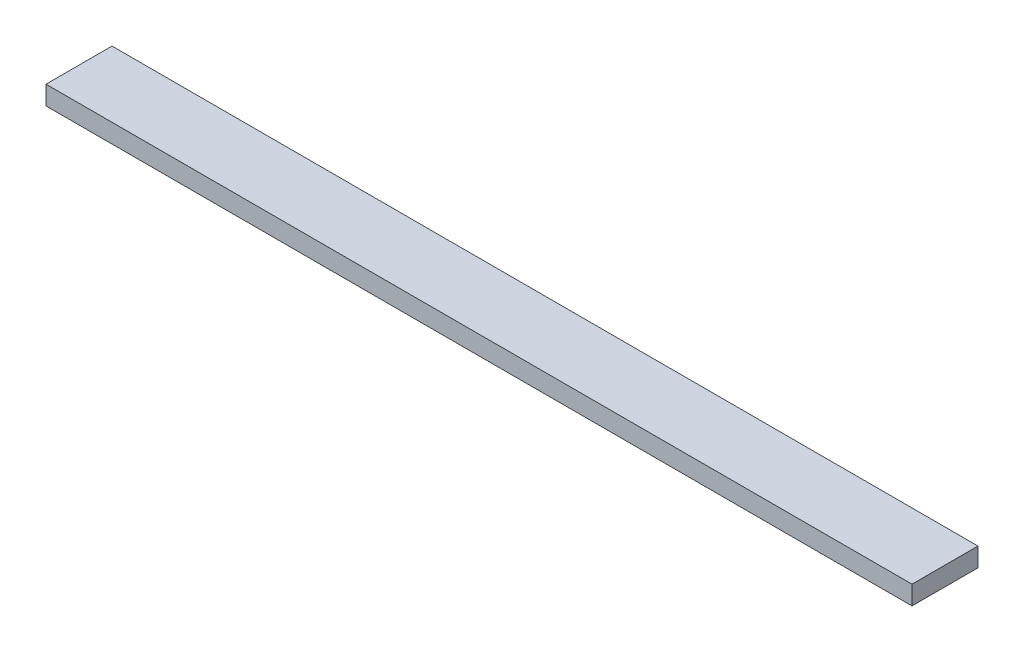
ISO-10303-21;
HEADER;
FILE_DESCRIPTION(('STEP AP214'),'2;1');
FILE_NAME('part.step','',(''),(''),'','','');
FILE_SCHEMA(('AUTOMOTIVE_DESIGN { 1 0 10303 214 1 1 1 1 }'));
ENDSEC;
DATA;
#1=APPLICATION_CONTEXT('core data for automotive mechanical design processes');
#2=APPLICATION_PROTOCOL_DEFINITION('international standard','automotive_design',2000,#1);
#3=PRODUCT_CONTEXT('',#1,'mechanical');
#4=PRODUCT('Part','Part','',(#3));
#5=PRODUCT_RELATED_PRODUCT_CATEGORY('part','',(#4));
#6=PRODUCT_DEFINITION_FORMATION('','',#4);
#7=PRODUCT_DEFINITION_CONTEXT('part definition',#1,'design');
#8=PRODUCT_DEFINITION('design','',#6,#7);
#9=PRODUCT_DEFINITION_SHAPE('','',#8);
#10=(LENGTH_UNIT() NAMED_UNIT(*) SI_UNIT(.MILLI.,.METRE.));
#11=(NAMED_UNIT(*) PLANE_ANGLE_UNIT() SI_UNIT($,.RADIAN.));
#12=(NAMED_UNIT(*) SI_UNIT($,.STERADIAN.) SOLID_ANGLE_UNIT());
#13=UNCERTAINTY_MEASURE_WITH_UNIT(LENGTH_MEASURE(1.E-05),#10,'distance_accuracy_value','');
#14=(GEOMETRIC_REPRESENTATION_CONTEXT(3) GLOBAL_UNCERTAINTY_ASSIGNED_CONTEXT((#13)) GLOBAL_UNIT_ASSIGNED_CONTEXT((#10,
#11,#12)) REPRESENTATION_CONTEXT('',''));
#15=CARTESIAN_POINT('',(0.,0.,0.));
#16=DIRECTION('',(0.,0.,1.));
#17=DIRECTION('',(1.,0.,0.));
#18=AXIS2_PLACEMENT_3D('',#15,#16,#17);
#19=CARTESIAN_POINT('',(91.833333351,4.,7.));
#20=DIRECTION('',(-1.,0.,0.));
#21=DIRECTION('',(0.,0.,1.));
#22=AXIS2_PLACEMENT_3D('',#19,#20,#21);
#23=PLANE('',#22);
#24=DIRECTION('',(0.,0.,-1.));
#25=VECTOR('',#24,1.);
#26=CARTESIAN_POINT('',(91.833333351,0.,7.));
#27=LINE('',#26,#25);
#28=CARTESIAN_POINT('',(91.833333351,0.,7.));
#29=VERTEX_POINT('',#28);
#30=CARTESIAN_POINT('',(91.833333351,0.,-7.));
#31=VERTEX_POINT('',#30);
#32=EDGE_CURVE('E110',#29,#31,#27,.T.);
#33=ORIENTED_EDGE('',*,*,#32,.T.);
#34=DIRECTION('',(0.,-1.,0.));
#35=VECTOR('',#34,1.);
#36=CARTESIAN_POINT('',(91.833333351,4.,-7.));
#37=LINE('',#36,#35);
#38=CARTESIAN_POINT('',(91.833333351,4.,-7.));
#39=VERTEX_POINT('',#38);
#40=EDGE_CURVE('E11',#39,#31,#37,.T.);
#41=ORIENTED_EDGE('',*,*,#40,.F.);
#42=DIRECTION('',(0.,0.,-1.));
#43=VECTOR('',#42,1.);
#44=CARTESIAN_POINT('',(91.833333351,4.,7.));
#45=LINE('',#44,#43);
#46=CARTESIAN_POINT('',(91.833333351,4.,7.));
#47=VERTEX_POINT('',#46);
#48=EDGE_CURVE('E93',#47,#39,#45,.T.);
#49=ORIENTED_EDGE('',*,*,#48,.F.);
#50=DIRECTION('',(0.,-1.,0.));
#51=VECTOR('',#50,1.);
#52=CARTESIAN_POINT('',(91.833333351,4.,7.));
#53=LINE('',#52,#51);
#54=EDGE_CURVE('E106',#47,#29,#53,.T.);
#55=ORIENTED_EDGE('',*,*,#54,.T.);
#56=EDGE_LOOP('',(#33,#41,#49,#55));
#57=FACE_BOUND('',#56,.T.);
#58=ADVANCED_FACE('F41',(#57),#23,.F.);
#59=CARTESIAN_POINT('',(-91.833333351,4.,-7.));
#60=DIRECTION('',(0.,0.,1.));
#61=DIRECTION('',(1.,0.,0.));
#62=AXIS2_PLACEMENT_3D('',#59,#60,#61);
#63=PLANE('',#62);
#64=DIRECTION('',(-1.,0.,0.));
#65=VECTOR('',#64,1.);
#66=CARTESIAN_POINT('',(-91.833333351,0.,-7.));
#67=LINE('',#66,#65);
#68=CARTESIAN_POINT('',(-91.833333351,0.,-7.));
#69=VERTEX_POINT('',#68);
#70=EDGE_CURVE('E98',#31,#69,#67,.T.);
#71=ORIENTED_EDGE('',*,*,#70,.T.);
#72=DIRECTION('',(0.,-1.,0.));
#73=VECTOR('',#72,1.);
#74=CARTESIAN_POINT('',(-91.833333351,4.,-7.));
#75=LINE('',#74,#73);
#76=CARTESIAN_POINT('',(-91.833333351,4.,-7.));
#77=VERTEX_POINT('',#76);
#78=EDGE_CURVE('E50',#77,#69,#75,.T.);
#79=ORIENTED_EDGE('',*,*,#78,.F.);
#80=DIRECTION('',(-1.,0.,0.));
#81=VECTOR('',#80,1.);
#82=CARTESIAN_POINT('',(-91.833333351,4.,-7.));
#83=LINE('',#82,#81);
#84=EDGE_CURVE('E88',#39,#77,#83,.T.);
#85=ORIENTED_EDGE('',*,*,#84,.F.);
#86=ORIENTED_EDGE('',*,*,#40,.T.);
#87=EDGE_LOOP('',(#71,#79,#85,#86));
#88=FACE_BOUND('',#87,.T.);
#89=ADVANCED_FACE('F97',(#88),#63,.F.);
#90=CARTESIAN_POINT('',(-91.833333351,4.,7.));
#91=DIRECTION('',(1.,0.,0.));
#92=DIRECTION('',(0.,0.,-1.));
#93=AXIS2_PLACEMENT_3D('',#90,#91,#92);
#94=PLANE('',#93);
#95=DIRECTION('',(0.,0.,1.));
#96=VECTOR('',#95,1.);
#97=CARTESIAN_POINT('',(-91.833333351,0.,7.));
#98=LINE('',#97,#96);
#99=CARTESIAN_POINT('',(-91.833333351,0.,7.));
#100=VERTEX_POINT('',#99);
#101=EDGE_CURVE('E75',#69,#100,#98,.T.);
#102=ORIENTED_EDGE('',*,*,#101,.T.);
#103=DIRECTION('',(0.,-1.,0.));
#104=VECTOR('',#103,1.);
#105=CARTESIAN_POINT('',(-91.833333351,4.,7.));
#106=LINE('',#105,#104);
#107=CARTESIAN_POINT('',(-91.833333351,4.,7.));
#108=VERTEX_POINT('',#107);
#109=EDGE_CURVE('E100',#108,#100,#106,.T.);
#110=ORIENTED_EDGE('',*,*,#109,.F.);
#111=DIRECTION('',(0.,0.,1.));
#112=VECTOR('',#111,1.);
#113=CARTESIAN_POINT('',(-91.833333351,4.,7.));
#114=LINE('',#113,#112);
#115=EDGE_CURVE('E91',#77,#108,#114,.T.);
#116=ORIENTED_EDGE('',*,*,#115,.F.);
#117=ORIENTED_EDGE('',*,*,#78,.T.);
#118=EDGE_LOOP('',(#102,#110,#116,#117));
#119=FACE_BOUND('',#118,.T.);
#120=ADVANCED_FACE('F101',(#119),#94,.F.);
#121=CARTESIAN_POINT('',(-91.833333351,4.,7.));
#122=DIRECTION('',(0.,0.,-1.));
#123=DIRECTION('',(-1.,0.,0.));
#124=AXIS2_PLACEMENT_3D('',#121,#122,#123);
#125=PLANE('',#124);
#126=DIRECTION('',(1.,0.,0.));
#127=VECTOR('',#126,1.);
#128=CARTESIAN_POINT('',(-91.833333351,0.,7.));
#129=LINE('',#128,#127);
#130=EDGE_CURVE('E81',#100,#29,#129,.T.);
#131=ORIENTED_EDGE('',*,*,#130,.T.);
#132=ORIENTED_EDGE('',*,*,#54,.F.);
#133=DIRECTION('',(1.,0.,0.));
#134=VECTOR('',#133,1.);
#135=CARTESIAN_POINT('',(-91.833333351,4.,7.));
#136=LINE('',#135,#134);
#137=EDGE_CURVE('E58',#108,#47,#136,.T.);
#138=ORIENTED_EDGE('',*,*,#137,.F.);
#139=ORIENTED_EDGE('',*,*,#109,.T.);
#140=EDGE_LOOP('',(#131,#132,#138,#139));
#141=FACE_BOUND('',#140,.T.);
#142=ADVANCED_FACE('F124',(#141),#125,.F.);
#143=CARTESIAN_POINT('',(0.,4.,0.));
#144=DIRECTION('',(0.,-1.,0.));
#145=DIRECTION('',(0.,0.,-1.));
#146=AXIS2_PLACEMENT_3D('',#143,#144,#145);
#147=PLANE('',#146);
#148=ORIENTED_EDGE('',*,*,#48,.T.);
#149=ORIENTED_EDGE('',*,*,#84,.T.);
#150=ORIENTED_EDGE('',*,*,#115,.T.);
#151=ORIENTED_EDGE('',*,*,#137,.T.);
#152=EDGE_LOOP('',(#148,#149,#150,#151));
#153=FACE_BOUND('',#152,.T.);
#154=ADVANCED_FACE('F89',(#153),#147,.F.);
#155=CARTESIAN_POINT('',(0.,0.,0.));
#156=DIRECTION('',(0.,-1.,0.));
#157=DIRECTION('',(0.,0.,-1.));
#158=AXIS2_PLACEMENT_3D('',#155,#156,#157);
#159=PLANE('',#158);
#160=ORIENTED_EDGE('',*,*,#32,.F.);
#161=ORIENTED_EDGE('',*,*,#130,.F.);
#162=ORIENTED_EDGE('',*,*,#101,.F.);
#163=ORIENTED_EDGE('',*,*,#70,.F.);
#164=EDGE_LOOP('',(#160,#161,#162,#163));
#165=FACE_BOUND('',#164,.T.);
#166=ADVANCED_FACE('F127',(#165),#159,.T.);
#167=CLOSED_SHELL('',(#58,#89,#120,#142,#154,#166));
#168=MANIFOLD_SOLID_BREP('B2',#167);
#169=ADVANCED_BREP_SHAPE_REPRESENTATION('',(#18,#168),#14);
#170=SHAPE_DEFINITION_REPRESENTATION(#9,#169);
ENDSEC;
END-ISO-10303-21;
